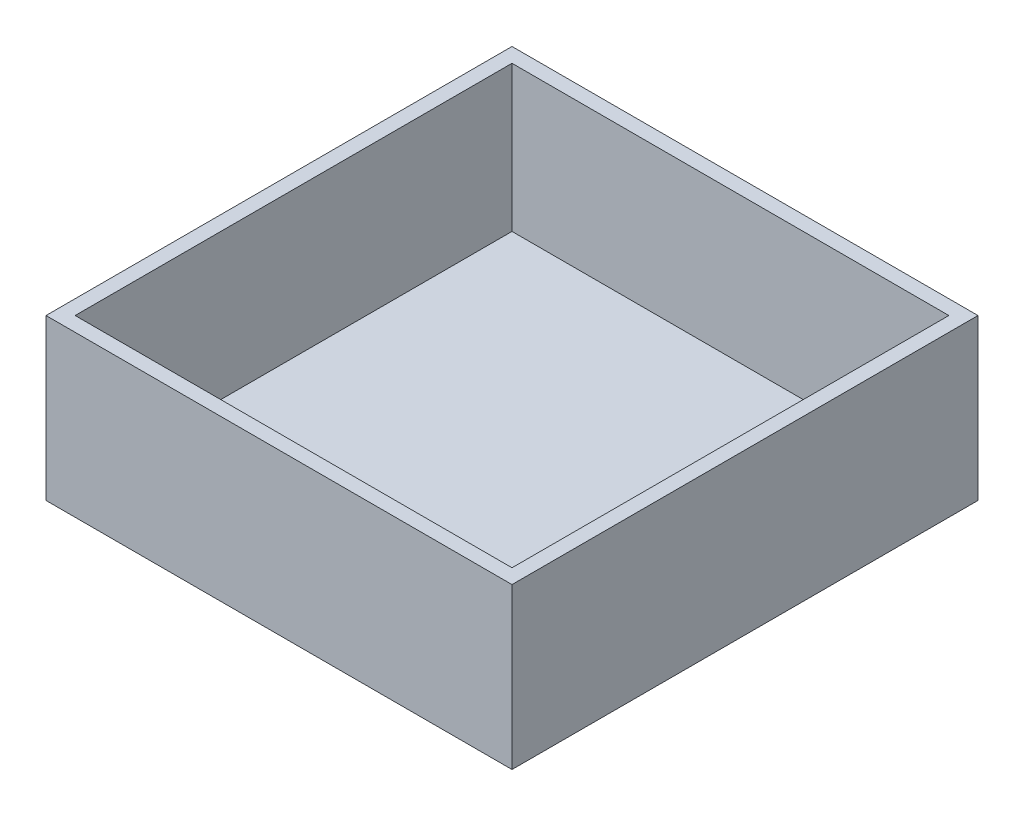
ISO-10303-21;
HEADER;
FILE_DESCRIPTION(('STEP AP214'),'2;1');
FILE_NAME('part.step','',(''),(''),'','','');
FILE_SCHEMA(('AUTOMOTIVE_DESIGN { 1 0 10303 214 1 1 1 1 }'));
ENDSEC;
DATA;
#1=APPLICATION_CONTEXT('core data for automotive mechanical design processes');
#2=APPLICATION_PROTOCOL_DEFINITION('international standard','automotive_design',2000,#1);
#3=PRODUCT_CONTEXT('',#1,'mechanical');
#4=PRODUCT('Part','Part','',(#3));
#5=PRODUCT_RELATED_PRODUCT_CATEGORY('part','',(#4));
#6=PRODUCT_DEFINITION_FORMATION('','',#4);
#7=PRODUCT_DEFINITION_CONTEXT('part definition',#1,'design');
#8=PRODUCT_DEFINITION('design','',#6,#7);
#9=PRODUCT_DEFINITION_SHAPE('','',#8);
#10=(LENGTH_UNIT() NAMED_UNIT(*) SI_UNIT(.MILLI.,.METRE.));
#11=(NAMED_UNIT(*) PLANE_ANGLE_UNIT() SI_UNIT($,.RADIAN.));
#12=(NAMED_UNIT(*) SI_UNIT($,.STERADIAN.) SOLID_ANGLE_UNIT());
#13=UNCERTAINTY_MEASURE_WITH_UNIT(LENGTH_MEASURE(1.E-05),#10,'distance_accuracy_value','');
#14=(GEOMETRIC_REPRESENTATION_CONTEXT(3) GLOBAL_UNCERTAINTY_ASSIGNED_CONTEXT((#13)) GLOBAL_UNIT_ASSIGNED_CONTEXT((#10,
#11,#12)) REPRESENTATION_CONTEXT('',''));
#15=CARTESIAN_POINT('',(0.,0.,0.));
#16=DIRECTION('',(0.,0.,1.));
#17=DIRECTION('',(1.,0.,0.));
#18=AXIS2_PLACEMENT_3D('',#15,#16,#17);
#19=CARTESIAN_POINT('',(0.,50.,0.));
#20=DIRECTION('',(0.,-1.,0.));
#21=DIRECTION('',(0.,0.,-1.));
#22=AXIS2_PLACEMENT_3D('',#19,#20,#21);
#23=PLANE('',#22);
#24=DIRECTION('',(0.,0.,1.));
#25=VECTOR('',#24,1.);
#26=CARTESIAN_POINT('',(-80.,50.,0.));
#27=LINE('',#26,#25);
#28=CARTESIAN_POINT('',(-80.,50.,-80.));
#29=VERTEX_POINT('',#28);
#30=CARTESIAN_POINT('',(-80.,50.,80.));
#31=VERTEX_POINT('',#30);
#32=EDGE_CURVE('E156',#29,#31,#27,.T.);
#33=ORIENTED_EDGE('',*,*,#32,.T.);
#34=DIRECTION('',(1.,0.,0.));
#35=VECTOR('',#34,1.);
#36=CARTESIAN_POINT('',(0.,50.,80.));
#37=LINE('',#36,#35);
#38=CARTESIAN_POINT('',(80.,50.,80.));
#39=VERTEX_POINT('',#38);
#40=EDGE_CURVE('E158',#31,#39,#37,.T.);
#41=ORIENTED_EDGE('',*,*,#40,.T.);
#42=DIRECTION('',(0.,0.,-1.));
#43=VECTOR('',#42,1.);
#44=CARTESIAN_POINT('',(80.,50.,0.));
#45=LINE('',#44,#43);
#46=CARTESIAN_POINT('',(80.,50.,-80.));
#47=VERTEX_POINT('',#46);
#48=EDGE_CURVE('E159',#39,#47,#45,.T.);
#49=ORIENTED_EDGE('',*,*,#48,.T.);
#50=DIRECTION('',(-1.,0.,0.));
#51=VECTOR('',#50,1.);
#52=CARTESIAN_POINT('',(0.,50.,-80.));
#53=LINE('',#52,#51);
#54=EDGE_CURVE('E37',#47,#29,#53,.T.);
#55=ORIENTED_EDGE('',*,*,#54,.T.);
#56=EDGE_LOOP('',(#33,#41,#49,#55));
#57=FACE_BOUND('',#56,.T.);
#58=DIRECTION('',(0.,0.,1.));
#59=VECTOR('',#58,1.);
#60=CARTESIAN_POINT('',(-75.,50.,75.));
#61=LINE('',#60,#59);
#62=CARTESIAN_POINT('',(-75.,50.,-75.));
#63=VERTEX_POINT('',#62);
#64=CARTESIAN_POINT('',(-75.,50.,75.));
#65=VERTEX_POINT('',#64);
#66=EDGE_CURVE('E102',#63,#65,#61,.T.);
#67=ORIENTED_EDGE('',*,*,#66,.F.);
#68=DIRECTION('',(-1.,0.,0.));
#69=VECTOR('',#68,1.);
#70=CARTESIAN_POINT('',(-75.,50.,-75.));
#71=LINE('',#70,#69);
#72=CARTESIAN_POINT('',(75.,50.,-75.));
#73=VERTEX_POINT('',#72);
#74=EDGE_CURVE('E127',#73,#63,#71,.T.);
#75=ORIENTED_EDGE('',*,*,#74,.F.);
#76=DIRECTION('',(0.,0.,-1.));
#77=VECTOR('',#76,1.);
#78=CARTESIAN_POINT('',(75.,50.,75.));
#79=LINE('',#78,#77);
#80=CARTESIAN_POINT('',(75.,50.,75.));
#81=VERTEX_POINT('',#80);
#82=EDGE_CURVE('E125',#81,#73,#79,.T.);
#83=ORIENTED_EDGE('',*,*,#82,.F.);
#84=DIRECTION('',(1.,0.,0.));
#85=VECTOR('',#84,1.);
#86=CARTESIAN_POINT('',(-75.,50.,75.));
#87=LINE('',#86,#85);
#88=EDGE_CURVE('E113',#65,#81,#87,.T.);
#89=ORIENTED_EDGE('',*,*,#88,.F.);
#90=EDGE_LOOP('',(#67,#75,#83,#89));
#91=FACE_BOUND('',#90,.T.);
#92=ADVANCED_FACE('F33',(#57,#91),#23,.F.);
#93=CARTESIAN_POINT('',(-80.,50.,75.));
#94=DIRECTION('',(1.,0.,0.));
#95=DIRECTION('',(0.,0.,-1.));
#96=AXIS2_PLACEMENT_3D('',#93,#94,#95);
#97=PLANE('',#96);
#98=DIRECTION('',(0.,0.,1.));
#99=VECTOR('',#98,1.);
#100=CARTESIAN_POINT('',(-80.,-5.,0.));
#101=LINE('',#100,#99);
#102=CARTESIAN_POINT('',(-80.,-5.,-80.));
#103=VERTEX_POINT('',#102);
#104=CARTESIAN_POINT('',(-80.,-5.,80.));
#105=VERTEX_POINT('',#104);
#106=EDGE_CURVE('E121',#103,#105,#101,.T.);
#107=ORIENTED_EDGE('',*,*,#106,.T.);
#108=DIRECTION('',(0.,-1.,0.));
#109=VECTOR('',#108,1.);
#110=CARTESIAN_POINT('',(-80.,50.,80.));
#111=LINE('',#110,#109);
#112=EDGE_CURVE('E11',#31,#105,#111,.T.);
#113=ORIENTED_EDGE('',*,*,#112,.F.);
#114=ORIENTED_EDGE('',*,*,#32,.F.);
#115=DIRECTION('',(0.,-1.,0.));
#116=VECTOR('',#115,1.);
#117=CARTESIAN_POINT('',(-80.,50.,-80.));
#118=LINE('',#117,#116);
#119=EDGE_CURVE('E143',#29,#103,#118,.T.);
#120=ORIENTED_EDGE('',*,*,#119,.T.);
#121=EDGE_LOOP('',(#107,#113,#114,#120));
#122=FACE_BOUND('',#121,.T.);
#123=ADVANCED_FACE('F173',(#122),#97,.F.);
#124=CARTESIAN_POINT('',(-75.,50.,80.));
#125=DIRECTION('',(0.,0.,-1.));
#126=DIRECTION('',(-1.,0.,0.));
#127=AXIS2_PLACEMENT_3D('',#124,#125,#126);
#128=PLANE('',#127);
#129=DIRECTION('',(1.,0.,0.));
#130=VECTOR('',#129,1.);
#131=CARTESIAN_POINT('',(0.,-5.,80.));
#132=LINE('',#131,#130);
#133=CARTESIAN_POINT('',(80.,-5.,80.));
#134=VERTEX_POINT('',#133);
#135=EDGE_CURVE('E141',#105,#134,#132,.T.);
#136=ORIENTED_EDGE('',*,*,#135,.T.);
#137=DIRECTION('',(0.,-1.,0.));
#138=VECTOR('',#137,1.);
#139=CARTESIAN_POINT('',(80.,50.,80.));
#140=LINE('',#139,#138);
#141=EDGE_CURVE('E42',#39,#134,#140,.T.);
#142=ORIENTED_EDGE('',*,*,#141,.F.);
#143=ORIENTED_EDGE('',*,*,#40,.F.);
#144=ORIENTED_EDGE('',*,*,#112,.T.);
#145=EDGE_LOOP('',(#136,#142,#143,#144));
#146=FACE_BOUND('',#145,.T.);
#147=ADVANCED_FACE('F175',(#146),#128,.F.);
#148=CARTESIAN_POINT('',(80.,50.,75.));
#149=DIRECTION('',(-1.,0.,0.));
#150=DIRECTION('',(0.,0.,1.));
#151=AXIS2_PLACEMENT_3D('',#148,#149,#150);
#152=PLANE('',#151);
#153=DIRECTION('',(0.,0.,-1.));
#154=VECTOR('',#153,1.);
#155=CARTESIAN_POINT('',(80.,-5.,0.));
#156=LINE('',#155,#154);
#157=CARTESIAN_POINT('',(80.,-5.,-80.));
#158=VERTEX_POINT('',#157);
#159=EDGE_CURVE('E148',#134,#158,#156,.T.);
#160=ORIENTED_EDGE('',*,*,#159,.T.);
#161=DIRECTION('',(0.,-1.,0.));
#162=VECTOR('',#161,1.);
#163=CARTESIAN_POINT('',(80.,50.,-80.));
#164=LINE('',#163,#162);
#165=EDGE_CURVE('E146',#47,#158,#164,.T.);
#166=ORIENTED_EDGE('',*,*,#165,.F.);
#167=ORIENTED_EDGE('',*,*,#48,.F.);
#168=ORIENTED_EDGE('',*,*,#141,.T.);
#169=EDGE_LOOP('',(#160,#166,#167,#168));
#170=FACE_BOUND('',#169,.T.);
#171=ADVANCED_FACE('F164',(#170),#152,.F.);
#172=CARTESIAN_POINT('',(-75.,50.,-80.));
#173=DIRECTION('',(0.,0.,1.));
#174=DIRECTION('',(1.,0.,0.));
#175=AXIS2_PLACEMENT_3D('',#172,#173,#174);
#176=PLANE('',#175);
#177=DIRECTION('',(-1.,0.,0.));
#178=VECTOR('',#177,1.);
#179=CARTESIAN_POINT('',(0.,-5.,-80.));
#180=LINE('',#179,#178);
#181=EDGE_CURVE('E152',#158,#103,#180,.T.);
#182=ORIENTED_EDGE('',*,*,#181,.T.);
#183=ORIENTED_EDGE('',*,*,#119,.F.);
#184=ORIENTED_EDGE('',*,*,#54,.F.);
#185=ORIENTED_EDGE('',*,*,#165,.T.);
#186=EDGE_LOOP('',(#182,#183,#184,#185));
#187=FACE_BOUND('',#186,.T.);
#188=ADVANCED_FACE('F168',(#187),#176,.F.);
#189=CARTESIAN_POINT('',(0.,-5.,0.));
#190=DIRECTION('',(0.,-1.,0.));
#191=DIRECTION('',(0.,0.,-1.));
#192=AXIS2_PLACEMENT_3D('',#189,#190,#191);
#193=PLANE('',#192);
#194=ORIENTED_EDGE('',*,*,#106,.F.);
#195=ORIENTED_EDGE('',*,*,#181,.F.);
#196=ORIENTED_EDGE('',*,*,#159,.F.);
#197=ORIENTED_EDGE('',*,*,#135,.F.);
#198=EDGE_LOOP('',(#194,#195,#196,#197));
#199=FACE_BOUND('',#198,.T.);
#200=ADVANCED_FACE('F35',(#199),#193,.T.);
#201=CARTESIAN_POINT('',(-75.,50.,75.));
#202=DIRECTION('',(1.,0.,0.));
#203=DIRECTION('',(0.,0.,-1.));
#204=AXIS2_PLACEMENT_3D('',#201,#202,#203);
#205=PLANE('',#204);
#206=DIRECTION('',(0.,0.,1.));
#207=VECTOR('',#206,1.);
#208=CARTESIAN_POINT('',(-75.,0.,75.));
#209=LINE('',#208,#207);
#210=CARTESIAN_POINT('',(-75.,0.,-75.));
#211=VERTEX_POINT('',#210);
#212=CARTESIAN_POINT('',(-75.,0.,75.));
#213=VERTEX_POINT('',#212);
#214=EDGE_CURVE('E131',#211,#213,#209,.T.);
#215=ORIENTED_EDGE('',*,*,#214,.F.);
#216=DIRECTION('',(0.,-1.,0.));
#217=VECTOR('',#216,1.);
#218=CARTESIAN_POINT('',(-75.,50.,-75.));
#219=LINE('',#218,#217);
#220=EDGE_CURVE('E109',#63,#211,#219,.T.);
#221=ORIENTED_EDGE('',*,*,#220,.F.);
#222=ORIENTED_EDGE('',*,*,#66,.T.);
#223=DIRECTION('',(0.,-1.,0.));
#224=VECTOR('',#223,1.);
#225=CARTESIAN_POINT('',(-75.,50.,75.));
#226=LINE('',#225,#224);
#227=EDGE_CURVE('E106',#65,#213,#226,.T.);
#228=ORIENTED_EDGE('',*,*,#227,.T.);
#229=EDGE_LOOP('',(#215,#221,#222,#228));
#230=FACE_BOUND('',#229,.T.);
#231=ADVANCED_FACE('F105',(#230),#205,.T.);
#232=CARTESIAN_POINT('',(-75.,50.,75.));
#233=DIRECTION('',(0.,0.,-1.));
#234=DIRECTION('',(-1.,0.,0.));
#235=AXIS2_PLACEMENT_3D('',#232,#233,#234);
#236=PLANE('',#235);
#237=DIRECTION('',(1.,0.,0.));
#238=VECTOR('',#237,1.);
#239=CARTESIAN_POINT('',(-75.,0.,75.));
#240=LINE('',#239,#238);
#241=CARTESIAN_POINT('',(75.,0.,75.));
#242=VERTEX_POINT('',#241);
#243=EDGE_CURVE('E120',#213,#242,#240,.T.);
#244=ORIENTED_EDGE('',*,*,#243,.F.);
#245=ORIENTED_EDGE('',*,*,#227,.F.);
#246=ORIENTED_EDGE('',*,*,#88,.T.);
#247=DIRECTION('',(0.,-1.,0.));
#248=VECTOR('',#247,1.);
#249=CARTESIAN_POINT('',(75.,50.,75.));
#250=LINE('',#249,#248);
#251=EDGE_CURVE('E122',#81,#242,#250,.T.);
#252=ORIENTED_EDGE('',*,*,#251,.T.);
#253=EDGE_LOOP('',(#244,#245,#246,#252));
#254=FACE_BOUND('',#253,.T.);
#255=ADVANCED_FACE('F117',(#254),#236,.T.);
#256=CARTESIAN_POINT('',(75.,50.,75.));
#257=DIRECTION('',(-1.,0.,0.));
#258=DIRECTION('',(0.,0.,1.));
#259=AXIS2_PLACEMENT_3D('',#256,#257,#258);
#260=PLANE('',#259);
#261=DIRECTION('',(0.,0.,-1.));
#262=VECTOR('',#261,1.);
#263=CARTESIAN_POINT('',(75.,0.,75.));
#264=LINE('',#263,#262);
#265=CARTESIAN_POINT('',(75.,0.,-75.));
#266=VERTEX_POINT('',#265);
#267=EDGE_CURVE('E134',#242,#266,#264,.T.);
#268=ORIENTED_EDGE('',*,*,#267,.F.);
#269=ORIENTED_EDGE('',*,*,#251,.F.);
#270=ORIENTED_EDGE('',*,*,#82,.T.);
#271=DIRECTION('',(0.,-1.,0.));
#272=VECTOR('',#271,1.);
#273=CARTESIAN_POINT('',(75.,50.,-75.));
#274=LINE('',#273,#272);
#275=EDGE_CURVE('E50',#73,#266,#274,.T.);
#276=ORIENTED_EDGE('',*,*,#275,.T.);
#277=EDGE_LOOP('',(#268,#269,#270,#276));
#278=FACE_BOUND('',#277,.T.);
#279=ADVANCED_FACE('F222',(#278),#260,.T.);
#280=CARTESIAN_POINT('',(-75.,50.,-75.));
#281=DIRECTION('',(0.,0.,1.));
#282=DIRECTION('',(1.,0.,0.));
#283=AXIS2_PLACEMENT_3D('',#280,#281,#282);
#284=PLANE('',#283);
#285=DIRECTION('',(-1.,0.,0.));
#286=VECTOR('',#285,1.);
#287=CARTESIAN_POINT('',(-75.,0.,-75.));
#288=LINE('',#287,#286);
#289=EDGE_CURVE('E114',#266,#211,#288,.T.);
#290=ORIENTED_EDGE('',*,*,#289,.F.);
#291=ORIENTED_EDGE('',*,*,#275,.F.);
#292=ORIENTED_EDGE('',*,*,#74,.T.);
#293=ORIENTED_EDGE('',*,*,#220,.T.);
#294=EDGE_LOOP('',(#290,#291,#292,#293));
#295=FACE_BOUND('',#294,.T.);
#296=ADVANCED_FACE('F230',(#295),#284,.T.);
#297=CARTESIAN_POINT('',(0.,0.,0.));
#298=DIRECTION('',(0.,-1.,0.));
#299=DIRECTION('',(0.,0.,-1.));
#300=AXIS2_PLACEMENT_3D('',#297,#298,#299);
#301=PLANE('',#300);
#302=ORIENTED_EDGE('',*,*,#214,.T.);
#303=ORIENTED_EDGE('',*,*,#243,.T.);
#304=ORIENTED_EDGE('',*,*,#267,.T.);
#305=ORIENTED_EDGE('',*,*,#289,.T.);
#306=EDGE_LOOP('',(#302,#303,#304,#305));
#307=FACE_BOUND('',#306,.T.);
#308=ADVANCED_FACE('F240',(#307),#301,.F.);
#309=CLOSED_SHELL('',(#92,#123,#147,#171,#188,#200,#231,#255,#279,#296,#308));
#310=MANIFOLD_SOLID_BREP('B2',#309);
#311=ADVANCED_BREP_SHAPE_REPRESENTATION('',(#18,#310),#14);
#312=SHAPE_DEFINITION_REPRESENTATION(#9,#311);
ENDSEC;
END-ISO-10303-21;
